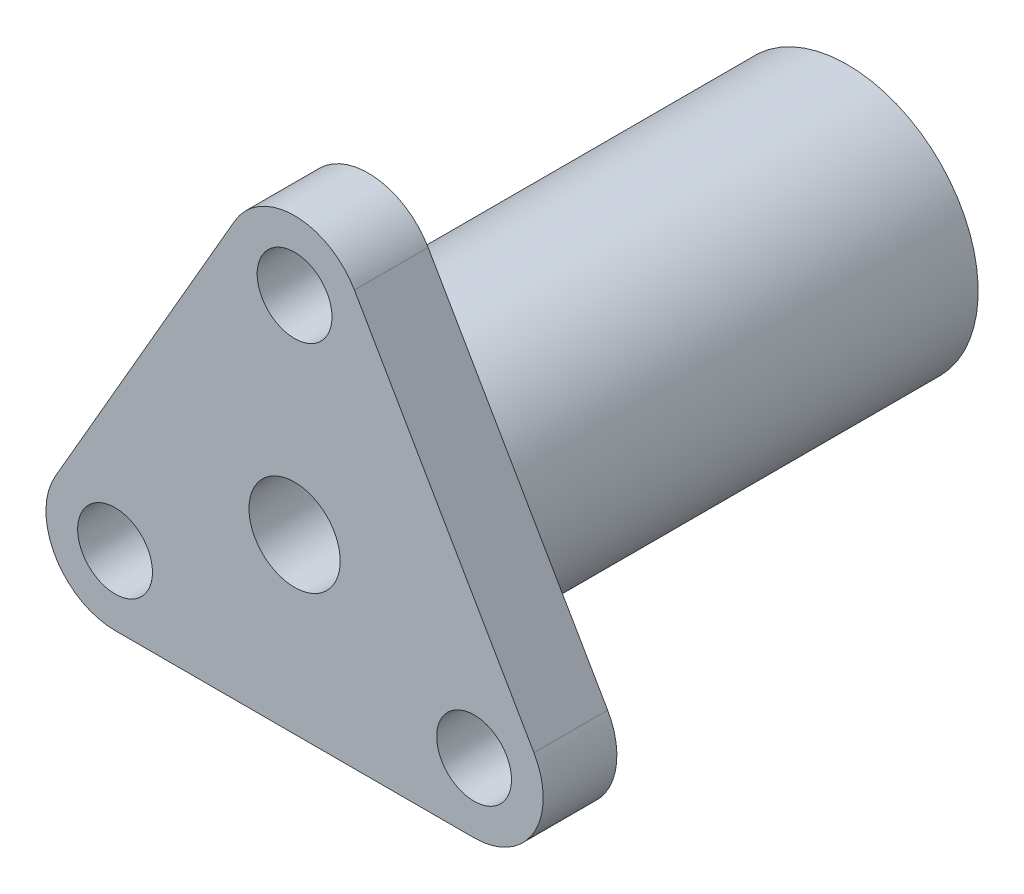
ISO-10303-21;
HEADER;
FILE_DESCRIPTION(('STEP AP214'),'2;1');
FILE_NAME('part.step','',(''),(''),'','','');
FILE_SCHEMA(('AUTOMOTIVE_DESIGN { 1 0 10303 214 1 1 1 1 }'));
ENDSEC;
DATA;
#1=APPLICATION_CONTEXT('core data for automotive mechanical design processes');
#2=APPLICATION_PROTOCOL_DEFINITION('international standard','automotive_design',2000,#1);
#3=PRODUCT_CONTEXT('',#1,'mechanical');
#4=PRODUCT('Part','Part','',(#3));
#5=PRODUCT_RELATED_PRODUCT_CATEGORY('part','',(#4));
#6=PRODUCT_DEFINITION_FORMATION('','',#4);
#7=PRODUCT_DEFINITION_CONTEXT('part definition',#1,'design');
#8=PRODUCT_DEFINITION('design','',#6,#7);
#9=PRODUCT_DEFINITION_SHAPE('','',#8);
#10=(LENGTH_UNIT() NAMED_UNIT(*) SI_UNIT(.MILLI.,.METRE.));
#11=(NAMED_UNIT(*) PLANE_ANGLE_UNIT() SI_UNIT($,.RADIAN.));
#12=(NAMED_UNIT(*) SI_UNIT($,.STERADIAN.) SOLID_ANGLE_UNIT());
#13=UNCERTAINTY_MEASURE_WITH_UNIT(LENGTH_MEASURE(1.E-05),#10,'distance_accuracy_value','');
#14=(GEOMETRIC_REPRESENTATION_CONTEXT(3) GLOBAL_UNCERTAINTY_ASSIGNED_CONTEXT((#13)) GLOBAL_UNIT_ASSIGNED_CONTEXT((#10,
#11,#12)) REPRESENTATION_CONTEXT('',''));
#15=CARTESIAN_POINT('',(0.,0.,0.));
#16=DIRECTION('',(0.,0.,1.));
#17=DIRECTION('',(1.,0.,0.));
#18=AXIS2_PLACEMENT_3D('',#15,#16,#17);
#19=CARTESIAN_POINT('',(0.,14.2875,0.));
#20=DIRECTION('',(0.,0.,-1.));
#21=DIRECTION('',(-1.,0.,0.));
#22=AXIS2_PLACEMENT_3D('',#19,#20,#21);
#23=PLANE('',#22);
#24=CARTESIAN_POINT('',(-12.3733379565702,-7.14375,0.));
#25=DIRECTION('',(0.,0.,1.));
#26=DIRECTION('',(1.,0.,0.));
#27=AXIS2_PLACEMENT_3D('',#24,#25,#26);
#28=CIRCLE('',#27,2.5781);
#29=CARTESIAN_POINT('',(-9.79523795657016,-7.14375,0.));
#30=VERTEX_POINT('',#29);
#31=EDGE_CURVE('E191',#30,#30,#28,.T.);
#32=ORIENTED_EDGE('',*,*,#31,.T.);
#33=EDGE_LOOP('',(#32));
#34=FACE_BOUND('',#33,.T.);
#35=CARTESIAN_POINT('',(0.,14.2875,0.));
#36=DIRECTION('',(0.,0.,1.));
#37=DIRECTION('',(1.,0.,0.));
#38=AXIS2_PLACEMENT_3D('',#35,#36,#37);
#39=CIRCLE('',#38,2.5781);
#40=CARTESIAN_POINT('',(2.5781,14.2875,0.));
#41=VERTEX_POINT('',#40);
#42=EDGE_CURVE('E88',#41,#41,#39,.T.);
#43=ORIENTED_EDGE('',*,*,#42,.T.);
#44=EDGE_LOOP('',(#43));
#45=FACE_BOUND('',#44,.T.);
#46=CARTESIAN_POINT('',(0.,14.2875,0.));
#47=DIRECTION('',(0.,0.,1.));
#48=DIRECTION('',(-1.,0.,0.));
#49=AXIS2_PLACEMENT_3D('',#46,#47,#48);
#50=CIRCLE('',#49,4.7625);
#51=CARTESIAN_POINT('',(4.12444598552339,16.66875,0.));
#52=VERTEX_POINT('',#51);
#53=CARTESIAN_POINT('',(-4.12444598552339,16.66875,0.));
#54=VERTEX_POINT('',#53);
#55=EDGE_CURVE('E71',#52,#54,#50,.T.);
#56=ORIENTED_EDGE('',*,*,#55,.F.);
#57=DIRECTION('',(-0.5,0.866025403784439,0.));
#58=VECTOR('',#57,1.);
#59=CARTESIAN_POINT('',(4.12444598552339,16.66875,0.));
#60=LINE('',#59,#58);
#61=CARTESIAN_POINT('',(16.4977839420936,-4.7625,0.));
#62=VERTEX_POINT('',#61);
#63=EDGE_CURVE('E97',#62,#52,#60,.T.);
#64=ORIENTED_EDGE('',*,*,#63,.F.);
#65=CARTESIAN_POINT('',(12.3733379565702,-7.14375,0.));
#66=DIRECTION('',(0.,0.,1.));
#67=DIRECTION('',(-1.,0.,0.));
#68=AXIS2_PLACEMENT_3D('',#65,#66,#67);
#69=CIRCLE('',#68,4.7625);
#70=CARTESIAN_POINT('',(12.3733379565702,-11.90625,0.));
#71=VERTEX_POINT('',#70);
#72=EDGE_CURVE('E95',#71,#62,#69,.T.);
#73=ORIENTED_EDGE('',*,*,#72,.F.);
#74=DIRECTION('',(1.,0.,0.));
#75=VECTOR('',#74,1.);
#76=CARTESIAN_POINT('',(12.3733379565702,-11.90625,0.));
#77=LINE('',#76,#75);
#78=CARTESIAN_POINT('',(-12.3733379565702,-11.90625,0.));
#79=VERTEX_POINT('',#78);
#80=EDGE_CURVE('E93',#79,#71,#77,.T.);
#81=ORIENTED_EDGE('',*,*,#80,.F.);
#82=CARTESIAN_POINT('',(-12.3733379565702,-7.14375,0.));
#83=DIRECTION('',(0.,0.,1.));
#84=DIRECTION('',(1.,0.,0.));
#85=AXIS2_PLACEMENT_3D('',#82,#83,#84);
#86=CIRCLE('',#85,4.7625);
#87=CARTESIAN_POINT('',(-16.4977839420936,-4.7625,0.));
#88=VERTEX_POINT('',#87);
#89=EDGE_CURVE('E73',#88,#79,#86,.T.);
#90=ORIENTED_EDGE('',*,*,#89,.F.);
#91=DIRECTION('',(-0.5,-0.866025403784439,0.));
#92=VECTOR('',#91,1.);
#93=CARTESIAN_POINT('',(-16.4977839420936,-4.7625,0.));
#94=LINE('',#93,#92);
#95=EDGE_CURVE('E67',#54,#88,#94,.T.);
#96=ORIENTED_EDGE('',*,*,#95,.F.);
#97=EDGE_LOOP('',(#56,#64,#73,#81,#90,#96));
#98=FACE_BOUND('',#97,.T.);
#99=CARTESIAN_POINT('',(12.3733379565702,-7.14375,0.));
#100=DIRECTION('',(0.,0.,1.));
#101=DIRECTION('',(1.,0.,0.));
#102=AXIS2_PLACEMENT_3D('',#99,#100,#101);
#103=CIRCLE('',#102,2.5781);
#104=CARTESIAN_POINT('',(14.9514379565702,-7.14375,0.));
#105=VERTEX_POINT('',#104);
#106=EDGE_CURVE('E196',#105,#105,#103,.T.);
#107=ORIENTED_EDGE('',*,*,#106,.T.);
#108=EDGE_LOOP('',(#107));
#109=FACE_BOUND('',#108,.T.);
#110=CARTESIAN_POINT('',(0.,0.,0.));
#111=DIRECTION('',(0.,0.,-1.));
#112=DIRECTION('',(-1.,0.,0.));
#113=AXIS2_PLACEMENT_3D('',#110,#111,#112);
#114=CIRCLE('',#113,9.017);
#115=CARTESIAN_POINT('',(-9.017,0.,0.));
#116=VERTEX_POINT('',#115);
#117=EDGE_CURVE('E183',#116,#116,#114,.T.);
#118=ORIENTED_EDGE('',*,*,#117,.F.);
#119=EDGE_LOOP('',(#118));
#120=FACE_BOUND('',#119,.T.);
#121=ADVANCED_FACE('F14',(#34,#45,#98,#109,#120),#23,.T.);
#122=CARTESIAN_POINT('',(0.,14.2875,5.08));
#123=DIRECTION('',(0.,0.,-1.));
#124=DIRECTION('',(-1.,0.,0.));
#125=AXIS2_PLACEMENT_3D('',#122,#123,#124);
#126=PLANE('',#125);
#127=CARTESIAN_POINT('',(0.,0.,5.08));
#128=DIRECTION('',(0.,0.,-1.));
#129=DIRECTION('',(-1.,0.,0.));
#130=AXIS2_PLACEMENT_3D('',#127,#128,#129);
#131=CIRCLE('',#130,3.14325);
#132=CARTESIAN_POINT('',(-3.14325,0.,5.08));
#133=VERTEX_POINT('',#132);
#134=EDGE_CURVE('E178',#133,#133,#131,.T.);
#135=ORIENTED_EDGE('',*,*,#134,.T.);
#136=EDGE_LOOP('',(#135));
#137=FACE_BOUND('',#136,.T.);
#138=CARTESIAN_POINT('',(12.3733379565702,-7.14375,5.08));
#139=DIRECTION('',(0.,0.,1.));
#140=DIRECTION('',(1.,0.,0.));
#141=AXIS2_PLACEMENT_3D('',#138,#139,#140);
#142=CIRCLE('',#141,2.5781);
#143=CARTESIAN_POINT('',(14.9514379565702,-7.14375,5.08));
#144=VERTEX_POINT('',#143);
#145=EDGE_CURVE('E199',#144,#144,#142,.T.);
#146=ORIENTED_EDGE('',*,*,#145,.F.);
#147=EDGE_LOOP('',(#146));
#148=FACE_BOUND('',#147,.T.);
#149=CARTESIAN_POINT('',(0.,14.2875,5.08));
#150=DIRECTION('',(0.,0.,1.));
#151=DIRECTION('',(-1.,0.,0.));
#152=AXIS2_PLACEMENT_3D('',#149,#150,#151);
#153=CIRCLE('',#152,4.7625);
#154=CARTESIAN_POINT('',(4.12444598552339,16.66875,5.08));
#155=VERTEX_POINT('',#154);
#156=CARTESIAN_POINT('',(-4.12444598552339,16.66875,5.08));
#157=VERTEX_POINT('',#156);
#158=EDGE_CURVE('E99',#155,#157,#153,.T.);
#159=ORIENTED_EDGE('',*,*,#158,.T.);
#160=DIRECTION('',(-0.5,-0.866025403784439,0.));
#161=VECTOR('',#160,1.);
#162=CARTESIAN_POINT('',(-16.4977839420936,-4.7625,5.08));
#163=LINE('',#162,#161);
#164=CARTESIAN_POINT('',(-16.4977839420936,-4.7625,5.08));
#165=VERTEX_POINT('',#164);
#166=EDGE_CURVE('E80',#157,#165,#163,.T.);
#167=ORIENTED_EDGE('',*,*,#166,.T.);
#168=CARTESIAN_POINT('',(-12.3733379565702,-7.14375,5.08));
#169=DIRECTION('',(0.,0.,1.));
#170=DIRECTION('',(1.,0.,0.));
#171=AXIS2_PLACEMENT_3D('',#168,#169,#170);
#172=CIRCLE('',#171,4.7625);
#173=CARTESIAN_POINT('',(-12.3733379565702,-11.90625,5.08));
#174=VERTEX_POINT('',#173);
#175=EDGE_CURVE('E102',#165,#174,#172,.T.);
#176=ORIENTED_EDGE('',*,*,#175,.T.);
#177=DIRECTION('',(1.,0.,0.));
#178=VECTOR('',#177,1.);
#179=CARTESIAN_POINT('',(12.3733379565702,-11.90625,5.08));
#180=LINE('',#179,#178);
#181=CARTESIAN_POINT('',(12.3733379565702,-11.90625,5.08));
#182=VERTEX_POINT('',#181);
#183=EDGE_CURVE('E104',#174,#182,#180,.T.);
#184=ORIENTED_EDGE('',*,*,#183,.T.);
#185=CARTESIAN_POINT('',(12.3733379565702,-7.14375,5.08));
#186=DIRECTION('',(0.,0.,1.));
#187=DIRECTION('',(-1.,0.,0.));
#188=AXIS2_PLACEMENT_3D('',#185,#186,#187);
#189=CIRCLE('',#188,4.7625);
#190=CARTESIAN_POINT('',(16.4977839420936,-4.7625,5.08));
#191=VERTEX_POINT('',#190);
#192=EDGE_CURVE('E34',#182,#191,#189,.T.);
#193=ORIENTED_EDGE('',*,*,#192,.T.);
#194=DIRECTION('',(-0.5,0.866025403784439,0.));
#195=VECTOR('',#194,1.);
#196=CARTESIAN_POINT('',(4.12444598552339,16.66875,5.08));
#197=LINE('',#196,#195);
#198=EDGE_CURVE('E29',#191,#155,#197,.T.);
#199=ORIENTED_EDGE('',*,*,#198,.T.);
#200=EDGE_LOOP('',(#159,#167,#176,#184,#193,#199));
#201=FACE_BOUND('',#200,.T.);
#202=CARTESIAN_POINT('',(0.,14.2875,5.08));
#203=DIRECTION('',(0.,0.,1.));
#204=DIRECTION('',(1.,0.,0.));
#205=AXIS2_PLACEMENT_3D('',#202,#203,#204);
#206=CIRCLE('',#205,2.5781);
#207=CARTESIAN_POINT('',(2.5781,14.2875,5.08));
#208=VERTEX_POINT('',#207);
#209=EDGE_CURVE('E85',#208,#208,#206,.T.);
#210=ORIENTED_EDGE('',*,*,#209,.F.);
#211=EDGE_LOOP('',(#210));
#212=FACE_BOUND('',#211,.T.);
#213=CARTESIAN_POINT('',(-12.3733379565702,-7.14375,5.08));
#214=DIRECTION('',(0.,0.,1.));
#215=DIRECTION('',(1.,0.,0.));
#216=AXIS2_PLACEMENT_3D('',#213,#214,#215);
#217=CIRCLE('',#216,2.5781);
#218=CARTESIAN_POINT('',(-9.79523795657016,-7.14375,5.08));
#219=VERTEX_POINT('',#218);
#220=EDGE_CURVE('E193',#219,#219,#217,.T.);
#221=ORIENTED_EDGE('',*,*,#220,.F.);
#222=EDGE_LOOP('',(#221));
#223=FACE_BOUND('',#222,.T.);
#224=ADVANCED_FACE('F122',(#137,#148,#201,#212,#223),#126,.F.);
#225=CARTESIAN_POINT('',(0.,14.2875,5.08));
#226=DIRECTION('',(0.,0.,-1.));
#227=DIRECTION('',(-1.,0.,0.));
#228=AXIS2_PLACEMENT_3D('',#225,#226,#227);
#229=CYLINDRICAL_SURFACE('',#228,4.7625);
#230=ORIENTED_EDGE('',*,*,#55,.T.);
#231=DIRECTION('',(0.,0.,-1.));
#232=VECTOR('',#231,1.);
#233=CARTESIAN_POINT('',(-4.12444598552339,16.66875,5.08));
#234=LINE('',#233,#232);
#235=EDGE_CURVE('E9',#157,#54,#234,.T.);
#236=ORIENTED_EDGE('',*,*,#235,.F.);
#237=ORIENTED_EDGE('',*,*,#158,.F.);
#238=DIRECTION('',(0.,0.,-1.));
#239=VECTOR('',#238,1.);
#240=CARTESIAN_POINT('',(4.12444598552339,16.66875,5.08));
#241=LINE('',#240,#239);
#242=EDGE_CURVE('E84',#155,#52,#241,.T.);
#243=ORIENTED_EDGE('',*,*,#242,.T.);
#244=EDGE_LOOP('',(#230,#236,#237,#243));
#245=FACE_BOUND('',#244,.T.);
#246=ADVANCED_FACE('F16',(#245),#229,.T.);
#247=CARTESIAN_POINT('',(-16.4977839420936,-4.7625,5.08));
#248=DIRECTION('',(0.866025403784439,-0.5,0.));
#249=DIRECTION('',(0.5,0.866025403784439,0.));
#250=AXIS2_PLACEMENT_3D('',#247,#248,#249);
#251=PLANE('',#250);
#252=ORIENTED_EDGE('',*,*,#95,.T.);
#253=DIRECTION('',(0.,0.,-1.));
#254=VECTOR('',#253,1.);
#255=CARTESIAN_POINT('',(-16.4977839420936,-4.7625,5.08));
#256=LINE('',#255,#254);
#257=EDGE_CURVE('E22',#165,#88,#256,.T.);
#258=ORIENTED_EDGE('',*,*,#257,.F.);
#259=ORIENTED_EDGE('',*,*,#166,.F.);
#260=ORIENTED_EDGE('',*,*,#235,.T.);
#261=EDGE_LOOP('',(#252,#258,#259,#260));
#262=FACE_BOUND('',#261,.T.);
#263=ADVANCED_FACE('F79',(#262),#251,.F.);
#264=CARTESIAN_POINT('',(-12.3733379565702,-7.14375,5.08));
#265=DIRECTION('',(0.,0.,-1.));
#266=DIRECTION('',(-1.,0.,0.));
#267=AXIS2_PLACEMENT_3D('',#264,#265,#266);
#268=CYLINDRICAL_SURFACE('',#267,4.7625);
#269=ORIENTED_EDGE('',*,*,#89,.T.);
#270=DIRECTION('',(0.,0.,-1.));
#271=VECTOR('',#270,1.);
#272=CARTESIAN_POINT('',(-12.3733379565702,-11.90625,5.08));
#273=LINE('',#272,#271);
#274=EDGE_CURVE('E115',#174,#79,#273,.T.);
#275=ORIENTED_EDGE('',*,*,#274,.F.);
#276=ORIENTED_EDGE('',*,*,#175,.F.);
#277=ORIENTED_EDGE('',*,*,#257,.T.);
#278=EDGE_LOOP('',(#269,#275,#276,#277));
#279=FACE_BOUND('',#278,.T.);
#280=ADVANCED_FACE('F119',(#279),#268,.T.);
#281=CARTESIAN_POINT('',(12.3733379565702,-11.90625,5.08));
#282=DIRECTION('',(0.,1.,0.));
#283=DIRECTION('',(-1.,0.,0.));
#284=AXIS2_PLACEMENT_3D('',#281,#282,#283);
#285=PLANE('',#284);
#286=ORIENTED_EDGE('',*,*,#80,.T.);
#287=DIRECTION('',(0.,0.,-1.));
#288=VECTOR('',#287,1.);
#289=CARTESIAN_POINT('',(12.3733379565702,-11.90625,5.08));
#290=LINE('',#289,#288);
#291=EDGE_CURVE('E112',#182,#71,#290,.T.);
#292=ORIENTED_EDGE('',*,*,#291,.F.);
#293=ORIENTED_EDGE('',*,*,#183,.F.);
#294=ORIENTED_EDGE('',*,*,#274,.T.);
#295=EDGE_LOOP('',(#286,#292,#293,#294));
#296=FACE_BOUND('',#295,.T.);
#297=ADVANCED_FACE('F126',(#296),#285,.F.);
#298=CARTESIAN_POINT('',(12.3733379565702,-7.14375,5.08));
#299=DIRECTION('',(0.,0.,-1.));
#300=DIRECTION('',(-1.,0.,0.));
#301=AXIS2_PLACEMENT_3D('',#298,#299,#300);
#302=CYLINDRICAL_SURFACE('',#301,4.7625);
#303=ORIENTED_EDGE('',*,*,#72,.T.);
#304=DIRECTION('',(0.,0.,-1.));
#305=VECTOR('',#304,1.);
#306=CARTESIAN_POINT('',(16.4977839420936,-4.7625,5.08));
#307=LINE('',#306,#305);
#308=EDGE_CURVE('E109',#191,#62,#307,.T.);
#309=ORIENTED_EDGE('',*,*,#308,.F.);
#310=ORIENTED_EDGE('',*,*,#192,.F.);
#311=ORIENTED_EDGE('',*,*,#291,.T.);
#312=EDGE_LOOP('',(#303,#309,#310,#311));
#313=FACE_BOUND('',#312,.T.);
#314=ADVANCED_FACE('F129',(#313),#302,.T.);
#315=CARTESIAN_POINT('',(4.12444598552339,16.66875,5.08));
#316=DIRECTION('',(-0.866025403784439,-0.5,0.));
#317=DIRECTION('',(0.5,-0.866025403784439,0.));
#318=AXIS2_PLACEMENT_3D('',#315,#316,#317);
#319=PLANE('',#318);
#320=ORIENTED_EDGE('',*,*,#63,.T.);
#321=ORIENTED_EDGE('',*,*,#242,.F.);
#322=ORIENTED_EDGE('',*,*,#198,.F.);
#323=ORIENTED_EDGE('',*,*,#308,.T.);
#324=EDGE_LOOP('',(#320,#321,#322,#323));
#325=FACE_BOUND('',#324,.T.);
#326=ADVANCED_FACE('F131',(#325),#319,.F.);
#327=CARTESIAN_POINT('',(0.,14.2875,5.08));
#328=DIRECTION('',(0.,0.,-1.));
#329=DIRECTION('',(-1.,0.,0.));
#330=AXIS2_PLACEMENT_3D('',#327,#328,#329);
#331=CYLINDRICAL_SURFACE('',#330,2.5781);
#332=ORIENTED_EDGE('',*,*,#209,.T.);
#333=EDGE_LOOP('',(#332));
#334=FACE_BOUND('',#333,.T.);
#335=ORIENTED_EDGE('',*,*,#42,.F.);
#336=EDGE_LOOP('',(#335));
#337=FACE_BOUND('',#336,.T.);
#338=ADVANCED_FACE('F133',(#334,#337),#331,.F.);
#339=CARTESIAN_POINT('',(12.3733379565702,-7.14375,5.08));
#340=DIRECTION('',(0.,0.,-1.));
#341=DIRECTION('',(-1.,0.,0.));
#342=AXIS2_PLACEMENT_3D('',#339,#340,#341);
#343=CYLINDRICAL_SURFACE('',#342,2.5781);
#344=ORIENTED_EDGE('',*,*,#145,.T.);
#345=EDGE_LOOP('',(#344));
#346=FACE_BOUND('',#345,.T.);
#347=ORIENTED_EDGE('',*,*,#106,.F.);
#348=EDGE_LOOP('',(#347));
#349=FACE_BOUND('',#348,.T.);
#350=ADVANCED_FACE('F141',(#346,#349),#343,.F.);
#351=CARTESIAN_POINT('',(-12.3733379565702,-7.14375,5.08));
#352=DIRECTION('',(0.,0.,-1.));
#353=DIRECTION('',(-1.,0.,0.));
#354=AXIS2_PLACEMENT_3D('',#351,#352,#353);
#355=CYLINDRICAL_SURFACE('',#354,2.5781);
#356=ORIENTED_EDGE('',*,*,#220,.T.);
#357=EDGE_LOOP('',(#356));
#358=FACE_BOUND('',#357,.T.);
#359=ORIENTED_EDGE('',*,*,#31,.F.);
#360=EDGE_LOOP('',(#359));
#361=FACE_BOUND('',#360,.T.);
#362=ADVANCED_FACE('F158',(#358,#361),#355,.F.);
#363=CARTESIAN_POINT('',(0.,0.,-33.02));
#364=DIRECTION('',(0.,0.,1.));
#365=DIRECTION('',(1.,0.,0.));
#366=AXIS2_PLACEMENT_3D('',#363,#364,#365);
#367=CYLINDRICAL_SURFACE('',#366,9.017);
#368=CARTESIAN_POINT('',(0.,0.,-33.02));
#369=DIRECTION('',(0.,0.,-1.));
#370=DIRECTION('',(-1.,0.,0.));
#371=AXIS2_PLACEMENT_3D('',#368,#369,#370);
#372=CIRCLE('',#371,9.017);
#373=CARTESIAN_POINT('',(-9.017,0.,-33.02));
#374=VERTEX_POINT('',#373);
#375=EDGE_CURVE('E188',#374,#374,#372,.T.);
#376=ORIENTED_EDGE('',*,*,#375,.F.);
#377=EDGE_LOOP('',(#376));
#378=FACE_BOUND('',#377,.T.);
#379=ORIENTED_EDGE('',*,*,#117,.T.);
#380=EDGE_LOOP('',(#379));
#381=FACE_BOUND('',#380,.T.);
#382=ADVANCED_FACE('F162',(#378,#381),#367,.T.);
#383=CARTESIAN_POINT('',(0.,0.,-33.02));
#384=DIRECTION('',(0.,0.,-1.));
#385=DIRECTION('',(-1.,0.,0.));
#386=AXIS2_PLACEMENT_3D('',#383,#384,#385);
#387=PLANE('',#386);
#388=CARTESIAN_POINT('',(0.,0.,-33.02));
#389=DIRECTION('',(0.,0.,-1.));
#390=DIRECTION('',(-1.,0.,0.));
#391=AXIS2_PLACEMENT_3D('',#388,#389,#390);
#392=CIRCLE('',#391,3.14325);
#393=CARTESIAN_POINT('',(-3.14325,0.,-33.02));
#394=VERTEX_POINT('',#393);
#395=EDGE_CURVE('E181',#394,#394,#392,.T.);
#396=ORIENTED_EDGE('',*,*,#395,.F.);
#397=EDGE_LOOP('',(#396));
#398=FACE_BOUND('',#397,.T.);
#399=ORIENTED_EDGE('',*,*,#375,.T.);
#400=EDGE_LOOP('',(#399));
#401=FACE_BOUND('',#400,.T.);
#402=ADVANCED_FACE('F165',(#398,#401),#387,.T.);
#403=CARTESIAN_POINT('',(0.,0.,5.08));
#404=DIRECTION('',(0.,0.,-1.));
#405=DIRECTION('',(-1.,0.,0.));
#406=AXIS2_PLACEMENT_3D('',#403,#404,#405);
#407=CYLINDRICAL_SURFACE('',#406,3.14325);
#408=ORIENTED_EDGE('',*,*,#134,.F.);
#409=EDGE_LOOP('',(#408));
#410=FACE_BOUND('',#409,.T.);
#411=ORIENTED_EDGE('',*,*,#395,.T.);
#412=EDGE_LOOP('',(#411));
#413=FACE_BOUND('',#412,.T.);
#414=ADVANCED_FACE('F169',(#410,#413),#407,.F.);
#415=CLOSED_SHELL('',(#121,#224,#246,#263,#280,#297,#314,#326,#338,#350,#362,#382,#402,#414));
#416=MANIFOLD_SOLID_BREP('B1',#415);
#417=ADVANCED_BREP_SHAPE_REPRESENTATION('',(#18,#416),#14);
#418=SHAPE_DEFINITION_REPRESENTATION(#9,#417);
ENDSEC;
END-ISO-10303-21;
